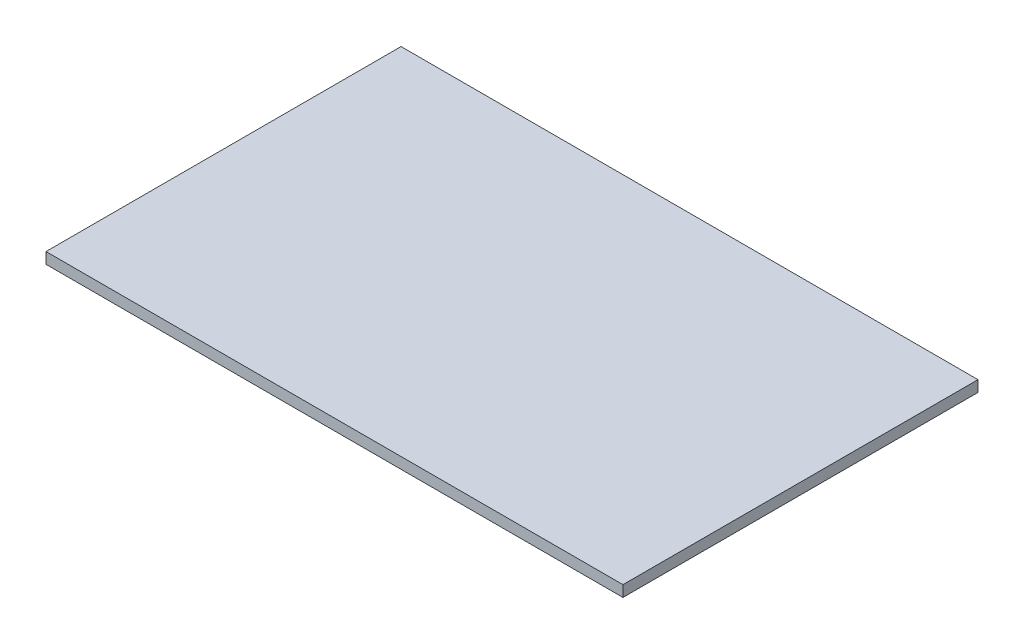
ISO-10303-21;
HEADER;
FILE_DESCRIPTION(('STEP AP214'),'2;1');
FILE_NAME('part.step','',(''),(''),'','','');
FILE_SCHEMA(('AUTOMOTIVE_DESIGN { 1 0 10303 214 1 1 1 1 }'));
ENDSEC;
DATA;
#1=APPLICATION_CONTEXT('core data for automotive mechanical design processes');
#2=APPLICATION_PROTOCOL_DEFINITION('international standard','automotive_design',2000,#1);
#3=PRODUCT_CONTEXT('',#1,'mechanical');
#4=PRODUCT('Part','Part','',(#3));
#5=PRODUCT_RELATED_PRODUCT_CATEGORY('part','',(#4));
#6=PRODUCT_DEFINITION_FORMATION('','',#4);
#7=PRODUCT_DEFINITION_CONTEXT('part definition',#1,'design');
#8=PRODUCT_DEFINITION('design','',#6,#7);
#9=PRODUCT_DEFINITION_SHAPE('','',#8);
#10=(LENGTH_UNIT() NAMED_UNIT(*) SI_UNIT(.MILLI.,.METRE.));
#11=(NAMED_UNIT(*) PLANE_ANGLE_UNIT() SI_UNIT($,.RADIAN.));
#12=(NAMED_UNIT(*) SI_UNIT($,.STERADIAN.) SOLID_ANGLE_UNIT());
#13=UNCERTAINTY_MEASURE_WITH_UNIT(LENGTH_MEASURE(1.E-05),#10,'distance_accuracy_value','');
#14=(GEOMETRIC_REPRESENTATION_CONTEXT(3) GLOBAL_UNCERTAINTY_ASSIGNED_CONTEXT((#13)) GLOBAL_UNIT_ASSIGNED_CONTEXT((#10,
#11,#12)) REPRESENTATION_CONTEXT('',''));
#15=CARTESIAN_POINT('',(0.,0.,0.));
#16=DIRECTION('',(0.,0.,1.));
#17=DIRECTION('',(1.,0.,0.));
#18=AXIS2_PLACEMENT_3D('',#15,#16,#17);
#19=CARTESIAN_POINT('',(52.,2.,32.));
#20=DIRECTION('',(-1.,0.,0.));
#21=DIRECTION('',(0.,0.,1.));
#22=AXIS2_PLACEMENT_3D('',#19,#20,#21);
#23=PLANE('',#22);
#24=DIRECTION('',(0.,0.,-1.));
#25=VECTOR('',#24,1.);
#26=CARTESIAN_POINT('',(52.,0.,32.));
#27=LINE('',#26,#25);
#28=CARTESIAN_POINT('',(52.,0.,32.));
#29=VERTEX_POINT('',#28);
#30=CARTESIAN_POINT('',(52.,0.,-32.));
#31=VERTEX_POINT('',#30);
#32=EDGE_CURVE('E100',#29,#31,#27,.T.);
#33=ORIENTED_EDGE('',*,*,#32,.T.);
#34=DIRECTION('',(0.,-1.,0.));
#35=VECTOR('',#34,1.);
#36=CARTESIAN_POINT('',(52.,2.,-32.));
#37=LINE('',#36,#35);
#38=CARTESIAN_POINT('',(52.,2.,-32.));
#39=VERTEX_POINT('',#38);
#40=EDGE_CURVE('E11',#39,#31,#37,.T.);
#41=ORIENTED_EDGE('',*,*,#40,.F.);
#42=DIRECTION('',(0.,0.,-1.));
#43=VECTOR('',#42,1.);
#44=CARTESIAN_POINT('',(52.,2.,32.));
#45=LINE('',#44,#43);
#46=CARTESIAN_POINT('',(52.,2.,32.));
#47=VERTEX_POINT('',#46);
#48=EDGE_CURVE('E88',#47,#39,#45,.T.);
#49=ORIENTED_EDGE('',*,*,#48,.F.);
#50=DIRECTION('',(0.,-1.,0.));
#51=VECTOR('',#50,1.);
#52=CARTESIAN_POINT('',(52.,2.,32.));
#53=LINE('',#52,#51);
#54=EDGE_CURVE('E96',#47,#29,#53,.T.);
#55=ORIENTED_EDGE('',*,*,#54,.T.);
#56=EDGE_LOOP('',(#33,#41,#49,#55));
#57=FACE_BOUND('',#56,.T.);
#58=ADVANCED_FACE('F37',(#57),#23,.F.);
#59=CARTESIAN_POINT('',(-52.,2.,-32.));
#60=DIRECTION('',(0.,0.,1.));
#61=DIRECTION('',(1.,0.,0.));
#62=AXIS2_PLACEMENT_3D('',#59,#60,#61);
#63=PLANE('',#62);
#64=DIRECTION('',(-1.,0.,0.));
#65=VECTOR('',#64,1.);
#66=CARTESIAN_POINT('',(-52.,0.,-32.));
#67=LINE('',#66,#65);
#68=CARTESIAN_POINT('',(-52.,0.,-32.));
#69=VERTEX_POINT('',#68);
#70=EDGE_CURVE('E92',#31,#69,#67,.T.);
#71=ORIENTED_EDGE('',*,*,#70,.T.);
#72=DIRECTION('',(0.,-1.,0.));
#73=VECTOR('',#72,1.);
#74=CARTESIAN_POINT('',(-52.,2.,-32.));
#75=LINE('',#74,#73);
#76=CARTESIAN_POINT('',(-52.,2.,-32.));
#77=VERTEX_POINT('',#76);
#78=EDGE_CURVE('E45',#77,#69,#75,.T.);
#79=ORIENTED_EDGE('',*,*,#78,.F.);
#80=DIRECTION('',(-1.,0.,0.));
#81=VECTOR('',#80,1.);
#82=CARTESIAN_POINT('',(-52.,2.,-32.));
#83=LINE('',#82,#81);
#84=EDGE_CURVE('E83',#39,#77,#83,.T.);
#85=ORIENTED_EDGE('',*,*,#84,.F.);
#86=ORIENTED_EDGE('',*,*,#40,.T.);
#87=EDGE_LOOP('',(#71,#79,#85,#86));
#88=FACE_BOUND('',#87,.T.);
#89=ADVANCED_FACE('F91',(#88),#63,.F.);
#90=CARTESIAN_POINT('',(-52.,2.,32.));
#91=DIRECTION('',(1.,0.,0.));
#92=DIRECTION('',(0.,0.,-1.));
#93=AXIS2_PLACEMENT_3D('',#90,#91,#92);
#94=PLANE('',#93);
#95=DIRECTION('',(0.,0.,1.));
#96=VECTOR('',#95,1.);
#97=CARTESIAN_POINT('',(-52.,0.,32.));
#98=LINE('',#97,#96);
#99=CARTESIAN_POINT('',(-52.,0.,32.));
#100=VERTEX_POINT('',#99);
#101=EDGE_CURVE('E70',#69,#100,#98,.T.);
#102=ORIENTED_EDGE('',*,*,#101,.T.);
#103=DIRECTION('',(0.,-1.,0.));
#104=VECTOR('',#103,1.);
#105=CARTESIAN_POINT('',(-52.,2.,32.));
#106=LINE('',#105,#104);
#107=CARTESIAN_POINT('',(-52.,2.,32.));
#108=VERTEX_POINT('',#107);
#109=EDGE_CURVE('E93',#108,#100,#106,.T.);
#110=ORIENTED_EDGE('',*,*,#109,.F.);
#111=DIRECTION('',(0.,0.,1.));
#112=VECTOR('',#111,1.);
#113=CARTESIAN_POINT('',(-52.,2.,32.));
#114=LINE('',#113,#112);
#115=EDGE_CURVE('E86',#77,#108,#114,.T.);
#116=ORIENTED_EDGE('',*,*,#115,.F.);
#117=ORIENTED_EDGE('',*,*,#78,.T.);
#118=EDGE_LOOP('',(#102,#110,#116,#117));
#119=FACE_BOUND('',#118,.T.);
#120=ADVANCED_FACE('F94',(#119),#94,.F.);
#121=CARTESIAN_POINT('',(-52.,2.,32.));
#122=DIRECTION('',(0.,0.,-1.));
#123=DIRECTION('',(-1.,0.,0.));
#124=AXIS2_PLACEMENT_3D('',#121,#122,#123);
#125=PLANE('',#124);
#126=DIRECTION('',(1.,0.,0.));
#127=VECTOR('',#126,1.);
#128=CARTESIAN_POINT('',(-52.,0.,32.));
#129=LINE('',#128,#127);
#130=EDGE_CURVE('E76',#100,#29,#129,.T.);
#131=ORIENTED_EDGE('',*,*,#130,.T.);
#132=ORIENTED_EDGE('',*,*,#54,.F.);
#133=DIRECTION('',(1.,0.,0.));
#134=VECTOR('',#133,1.);
#135=CARTESIAN_POINT('',(-52.,2.,32.));
#136=LINE('',#135,#134);
#137=EDGE_CURVE('E53',#108,#47,#136,.T.);
#138=ORIENTED_EDGE('',*,*,#137,.F.);
#139=ORIENTED_EDGE('',*,*,#109,.T.);
#140=EDGE_LOOP('',(#131,#132,#138,#139));
#141=FACE_BOUND('',#140,.T.);
#142=ADVANCED_FACE('F107',(#141),#125,.F.);
#143=CARTESIAN_POINT('',(0.,2.,0.));
#144=DIRECTION('',(0.,-1.,0.));
#145=DIRECTION('',(0.,0.,-1.));
#146=AXIS2_PLACEMENT_3D('',#143,#144,#145);
#147=PLANE('',#146);
#148=ORIENTED_EDGE('',*,*,#48,.T.);
#149=ORIENTED_EDGE('',*,*,#84,.T.);
#150=ORIENTED_EDGE('',*,*,#115,.T.);
#151=ORIENTED_EDGE('',*,*,#137,.T.);
#152=EDGE_LOOP('',(#148,#149,#150,#151));
#153=FACE_BOUND('',#152,.T.);
#154=ADVANCED_FACE('F84',(#153),#147,.F.);
#155=CARTESIAN_POINT('',(0.,0.,0.));
#156=DIRECTION('',(0.,-1.,0.));
#157=DIRECTION('',(0.,0.,-1.));
#158=AXIS2_PLACEMENT_3D('',#155,#156,#157);
#159=PLANE('',#158);
#160=ORIENTED_EDGE('',*,*,#32,.F.);
#161=ORIENTED_EDGE('',*,*,#130,.F.);
#162=ORIENTED_EDGE('',*,*,#101,.F.);
#163=ORIENTED_EDGE('',*,*,#70,.F.);
#164=EDGE_LOOP('',(#160,#161,#162,#163));
#165=FACE_BOUND('',#164,.T.);
#166=ADVANCED_FACE('F110',(#165),#159,.T.);
#167=CLOSED_SHELL('',(#58,#89,#120,#142,#154,#166));
#168=MANIFOLD_SOLID_BREP('B2',#167);
#169=ADVANCED_BREP_SHAPE_REPRESENTATION('',(#18,#168),#14);
#170=SHAPE_DEFINITION_REPRESENTATION(#9,#169);
ENDSEC;
END-ISO-10303-21;
